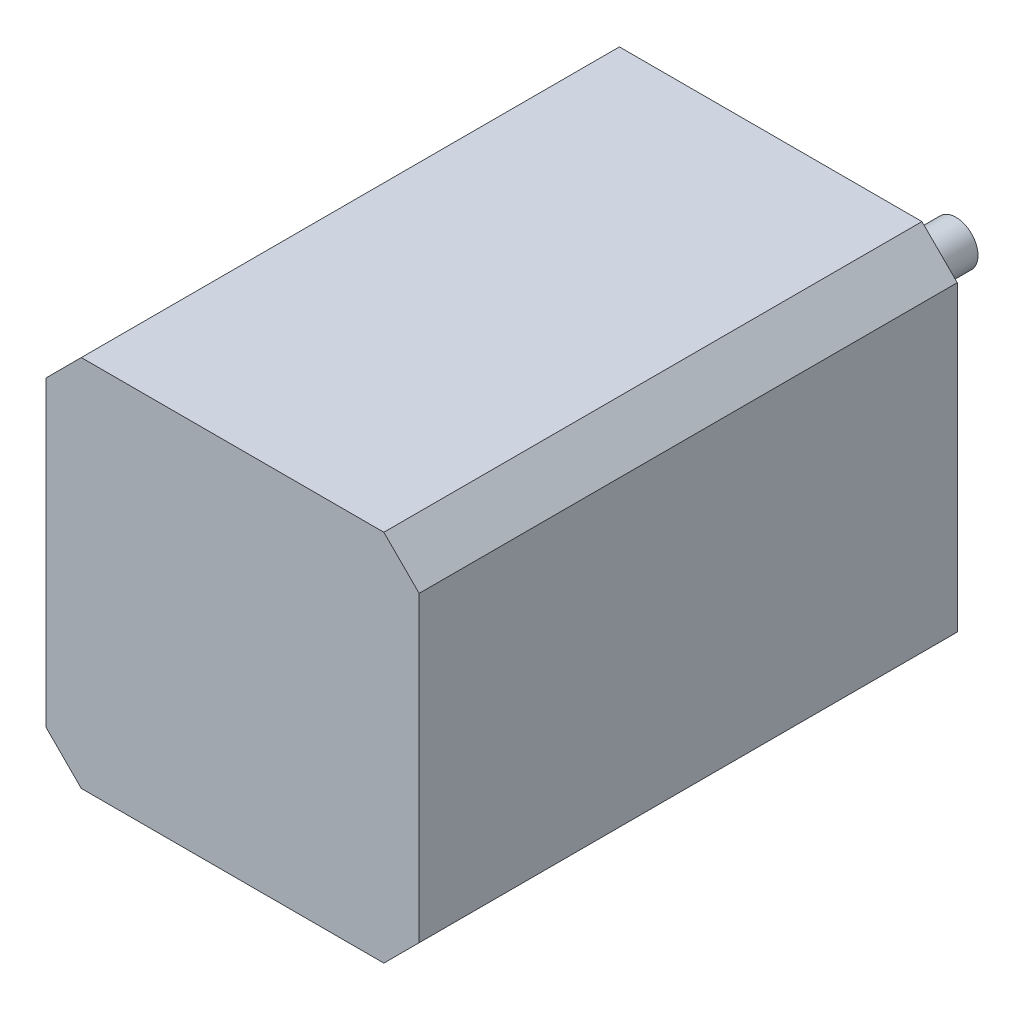
ISO-10303-21;
HEADER;
FILE_DESCRIPTION(('STEP AP214'),'2;1');
FILE_NAME('part.step','',(''),(''),'','','');
FILE_SCHEMA(('AUTOMOTIVE_DESIGN { 1 0 10303 214 1 1 1 1 }'));
ENDSEC;
DATA;
#1=APPLICATION_CONTEXT('core data for automotive mechanical design processes');
#2=APPLICATION_PROTOCOL_DEFINITION('international standard','automotive_design',2000,#1);
#3=PRODUCT_CONTEXT('',#1,'mechanical');
#4=PRODUCT('Part','Part','',(#3));
#5=PRODUCT_RELATED_PRODUCT_CATEGORY('part','',(#4));
#6=PRODUCT_DEFINITION_FORMATION('','',#4);
#7=PRODUCT_DEFINITION_CONTEXT('part definition',#1,'design');
#8=PRODUCT_DEFINITION('design','',#6,#7);
#9=PRODUCT_DEFINITION_SHAPE('','',#8);
#10=(LENGTH_UNIT() NAMED_UNIT(*) SI_UNIT(.MILLI.,.METRE.));
#11=(NAMED_UNIT(*) PLANE_ANGLE_UNIT() SI_UNIT($,.RADIAN.));
#12=(NAMED_UNIT(*) SI_UNIT($,.STERADIAN.) SOLID_ANGLE_UNIT());
#13=UNCERTAINTY_MEASURE_WITH_UNIT(LENGTH_MEASURE(1.E-05),#10,'distance_accuracy_value','');
#14=(GEOMETRIC_REPRESENTATION_CONTEXT(3) GLOBAL_UNCERTAINTY_ASSIGNED_CONTEXT((#13)) GLOBAL_UNIT_ASSIGNED_CONTEXT((#10,
#11,#12)) REPRESENTATION_CONTEXT('',''));
#15=CARTESIAN_POINT('',(0.,0.,0.));
#16=DIRECTION('',(0.,0.,1.));
#17=DIRECTION('',(1.,0.,0.));
#18=AXIS2_PLACEMENT_3D('',#15,#16,#17);
#19=CARTESIAN_POINT('',(0.,0.,-21.));
#20=DIRECTION('',(0.,0.,1.));
#21=DIRECTION('',(1.,0.,0.));
#22=AXIS2_PLACEMENT_3D('',#19,#20,#21);
#23=CYLINDRICAL_SURFACE('',#22,2.5);
#24=CARTESIAN_POINT('',(0.,0.,-21.));
#25=DIRECTION('',(0.,0.,1.));
#26=DIRECTION('',(1.,0.,0.));
#27=AXIS2_PLACEMENT_3D('',#24,#25,#26);
#28=CIRCLE('',#27,2.5);
#29=CARTESIAN_POINT('',(2.5,0.,-21.));
#30=VERTEX_POINT('',#29);
#31=EDGE_CURVE('E11',#30,#30,#28,.T.);
#32=ORIENTED_EDGE('',*,*,#31,.T.);
#33=EDGE_LOOP('',(#32));
#34=FACE_BOUND('',#33,.T.);
#35=CARTESIAN_POINT('',(0.,0.,-2.));
#36=DIRECTION('',(0.,0.,1.));
#37=DIRECTION('',(1.,0.,0.));
#38=AXIS2_PLACEMENT_3D('',#35,#36,#37);
#39=CIRCLE('',#38,2.5);
#40=CARTESIAN_POINT('',(2.5,0.,-2.));
#41=VERTEX_POINT('',#40);
#42=EDGE_CURVE('E53',#41,#41,#39,.T.);
#43=ORIENTED_EDGE('',*,*,#42,.F.);
#44=EDGE_LOOP('',(#43));
#45=FACE_BOUND('',#44,.T.);
#46=ADVANCED_FACE('F50',(#34,#45),#23,.T.);
#47=CARTESIAN_POINT('',(0.,0.,-21.));
#48=DIRECTION('',(0.,0.,1.));
#49=DIRECTION('',(1.,0.,0.));
#50=AXIS2_PLACEMENT_3D('',#47,#48,#49);
#51=PLANE('',#50);
#52=ORIENTED_EDGE('',*,*,#31,.F.);
#53=EDGE_LOOP('',(#52));
#54=FACE_BOUND('',#53,.T.);
#55=ADVANCED_FACE('F65',(#54),#51,.F.);
#56=CARTESIAN_POINT('',(0.,0.,-2.));
#57=DIRECTION('',(0.,0.,1.));
#58=DIRECTION('',(1.,0.,0.));
#59=AXIS2_PLACEMENT_3D('',#56,#57,#58);
#60=PLANE('',#59);
#61=ORIENTED_EDGE('',*,*,#42,.T.);
#62=EDGE_LOOP('',(#61));
#63=FACE_BOUND('',#62,.T.);
#64=ADVANCED_FACE('F62',(#63),#60,.T.);
#65=CLOSED_SHELL('',(#46,#55,#64));
#66=MANIFOLD_SOLID_BREP('B2',#65);
#67=CARTESIAN_POINT('',(21.15,0.,61.));
#68=DIRECTION('',(1.,0.,0.));
#69=DIRECTION('',(0.,1.,0.));
#70=AXIS2_PLACEMENT_3D('',#67,#68,#69);
#71=PLANE('',#70);
#72=DIRECTION('',(0.,-1.,0.));
#73=VECTOR('',#72,1.);
#74=CARTESIAN_POINT('',(21.15,0.,61.));
#75=LINE('',#74,#73);
#76=CARTESIAN_POINT('',(21.15,17.15,61.));
#77=VERTEX_POINT('',#76);
#78=CARTESIAN_POINT('',(21.15,-17.15,61.));
#79=VERTEX_POINT('',#78);
#80=EDGE_CURVE('E216',#77,#79,#75,.T.);
#81=ORIENTED_EDGE('',*,*,#80,.T.);
#82=DIRECTION('',(0.,0.,-1.));
#83=VECTOR('',#82,1.);
#84=CARTESIAN_POINT('',(21.15,-17.15,0.));
#85=LINE('',#84,#83);
#86=CARTESIAN_POINT('',(21.15,-17.15,0.));
#87=VERTEX_POINT('',#86);
#88=EDGE_CURVE('E176',#79,#87,#85,.T.);
#89=ORIENTED_EDGE('',*,*,#88,.T.);
#90=DIRECTION('',(0.,-1.,0.));
#91=VECTOR('',#90,1.);
#92=CARTESIAN_POINT('',(21.15,0.,0.));
#93=LINE('',#92,#91);
#94=CARTESIAN_POINT('',(21.15,17.15,0.));
#95=VERTEX_POINT('',#94);
#96=EDGE_CURVE('E160',#95,#87,#93,.T.);
#97=ORIENTED_EDGE('',*,*,#96,.F.);
#98=DIRECTION('',(0.,0.,1.));
#99=VECTOR('',#98,1.);
#100=CARTESIAN_POINT('',(21.15,17.15,61.));
#101=LINE('',#100,#99);
#102=EDGE_CURVE('E173',#95,#77,#101,.T.);
#103=ORIENTED_EDGE('',*,*,#102,.T.);
#104=EDGE_LOOP('',(#81,#89,#97,#103));
#105=FACE_BOUND('',#104,.T.);
#106=ADVANCED_FACE('F90',(#105),#71,.T.);
#107=CARTESIAN_POINT('',(0.,21.15,61.));
#108=DIRECTION('',(0.,1.,0.));
#109=DIRECTION('',(0.,0.,1.));
#110=AXIS2_PLACEMENT_3D('',#107,#108,#109);
#111=PLANE('',#110);
#112=DIRECTION('',(1.,0.,0.));
#113=VECTOR('',#112,1.);
#114=CARTESIAN_POINT('',(0.,21.15,61.));
#115=LINE('',#114,#113);
#116=CARTESIAN_POINT('',(-17.15,21.15,61.));
#117=VERTEX_POINT('',#116);
#118=CARTESIAN_POINT('',(17.15,21.15,61.));
#119=VERTEX_POINT('',#118);
#120=EDGE_CURVE('E214',#117,#119,#115,.T.);
#121=ORIENTED_EDGE('',*,*,#120,.T.);
#122=DIRECTION('',(0.,0.,-1.));
#123=VECTOR('',#122,1.);
#124=CARTESIAN_POINT('',(17.15,21.15,61.));
#125=LINE('',#124,#123);
#126=CARTESIAN_POINT('',(17.15,21.15,0.));
#127=VERTEX_POINT('',#126);
#128=EDGE_CURVE('E209',#119,#127,#125,.T.);
#129=ORIENTED_EDGE('',*,*,#128,.T.);
#130=DIRECTION('',(1.,0.,0.));
#131=VECTOR('',#130,1.);
#132=CARTESIAN_POINT('',(0.,21.15,0.));
#133=LINE('',#132,#131);
#134=CARTESIAN_POINT('',(-17.15,21.15,0.));
#135=VERTEX_POINT('',#134);
#136=EDGE_CURVE('E162',#135,#127,#133,.T.);
#137=ORIENTED_EDGE('',*,*,#136,.F.);
#138=DIRECTION('',(0.,0.,1.));
#139=VECTOR('',#138,1.);
#140=CARTESIAN_POINT('',(-17.15,21.15,61.));
#141=LINE('',#140,#139);
#142=EDGE_CURVE('E207',#135,#117,#141,.T.);
#143=ORIENTED_EDGE('',*,*,#142,.T.);
#144=EDGE_LOOP('',(#121,#129,#137,#143));
#145=FACE_BOUND('',#144,.T.);
#146=ADVANCED_FACE('F212',(#145),#111,.T.);
#147=CARTESIAN_POINT('',(-21.15,0.,61.));
#148=DIRECTION('',(1.,0.,0.));
#149=DIRECTION('',(0.,1.,0.));
#150=AXIS2_PLACEMENT_3D('',#147,#148,#149);
#151=PLANE('',#150);
#152=DIRECTION('',(0.,-1.,0.));
#153=VECTOR('',#152,1.);
#154=CARTESIAN_POINT('',(-21.15,0.,61.));
#155=LINE('',#154,#153);
#156=CARTESIAN_POINT('',(-21.15,17.15,61.));
#157=VERTEX_POINT('',#156);
#158=CARTESIAN_POINT('',(-21.15,-17.15,61.));
#159=VERTEX_POINT('',#158);
#160=EDGE_CURVE('E215',#157,#159,#155,.T.);
#161=ORIENTED_EDGE('',*,*,#160,.F.);
#162=DIRECTION('',(0.,0.,-1.));
#163=VECTOR('',#162,1.);
#164=CARTESIAN_POINT('',(-21.15,17.15,0.));
#165=LINE('',#164,#163);
#166=CARTESIAN_POINT('',(-21.15,17.15,0.));
#167=VERTEX_POINT('',#166);
#168=EDGE_CURVE('E48',#157,#167,#165,.T.);
#169=ORIENTED_EDGE('',*,*,#168,.T.);
#170=DIRECTION('',(0.,-1.,0.));
#171=VECTOR('',#170,1.);
#172=CARTESIAN_POINT('',(-21.15,0.,0.));
#173=LINE('',#172,#171);
#174=CARTESIAN_POINT('',(-21.15,-17.15,0.));
#175=VERTEX_POINT('',#174);
#176=EDGE_CURVE('E224',#167,#175,#173,.T.);
#177=ORIENTED_EDGE('',*,*,#176,.T.);
#178=DIRECTION('',(0.,0.,1.));
#179=VECTOR('',#178,1.);
#180=CARTESIAN_POINT('',(-21.15,-17.15,61.));
#181=LINE('',#180,#179);
#182=EDGE_CURVE('E99',#175,#159,#181,.T.);
#183=ORIENTED_EDGE('',*,*,#182,.T.);
#184=EDGE_LOOP('',(#161,#169,#177,#183));
#185=FACE_BOUND('',#184,.T.);
#186=ADVANCED_FACE('F242',(#185),#151,.F.);
#187=CARTESIAN_POINT('',(0.,-21.15,61.));
#188=DIRECTION('',(0.,1.,0.));
#189=DIRECTION('',(0.,0.,1.));
#190=AXIS2_PLACEMENT_3D('',#187,#188,#189);
#191=PLANE('',#190);
#192=DIRECTION('',(1.,0.,0.));
#193=VECTOR('',#192,1.);
#194=CARTESIAN_POINT('',(0.,-21.15,0.));
#195=LINE('',#194,#193);
#196=CARTESIAN_POINT('',(-17.15,-21.15,0.));
#197=VERTEX_POINT('',#196);
#198=CARTESIAN_POINT('',(17.15,-21.15,0.));
#199=VERTEX_POINT('',#198);
#200=EDGE_CURVE('E190',#197,#199,#195,.T.);
#201=ORIENTED_EDGE('',*,*,#200,.T.);
#202=DIRECTION('',(0.,0.,1.));
#203=VECTOR('',#202,1.);
#204=CARTESIAN_POINT('',(17.15,-21.15,61.));
#205=LINE('',#204,#203);
#206=CARTESIAN_POINT('',(17.15,-21.15,61.));
#207=VERTEX_POINT('',#206);
#208=EDGE_CURVE('E199',#199,#207,#205,.T.);
#209=ORIENTED_EDGE('',*,*,#208,.T.);
#210=DIRECTION('',(1.,0.,0.));
#211=VECTOR('',#210,1.);
#212=CARTESIAN_POINT('',(0.,-21.15,61.));
#213=LINE('',#212,#211);
#214=CARTESIAN_POINT('',(-17.15,-21.15,61.));
#215=VERTEX_POINT('',#214);
#216=EDGE_CURVE('E187',#215,#207,#213,.T.);
#217=ORIENTED_EDGE('',*,*,#216,.F.);
#218=DIRECTION('',(0.,0.,-1.));
#219=VECTOR('',#218,1.);
#220=CARTESIAN_POINT('',(-17.15,-21.15,61.));
#221=LINE('',#220,#219);
#222=EDGE_CURVE('E196',#215,#197,#221,.T.);
#223=ORIENTED_EDGE('',*,*,#222,.T.);
#224=EDGE_LOOP('',(#201,#209,#217,#223));
#225=FACE_BOUND('',#224,.T.);
#226=ADVANCED_FACE('F230',(#225),#191,.F.);
#227=CARTESIAN_POINT('',(0.,0.,61.));
#228=DIRECTION('',(0.,0.,1.));
#229=DIRECTION('',(1.,0.,0.));
#230=AXIS2_PLACEMENT_3D('',#227,#228,#229);
#231=PLANE('',#230);
#232=ORIENTED_EDGE('',*,*,#216,.T.);
#233=DIRECTION('',(0.70710678118655,0.707106781186545,0.));
#234=VECTOR('',#233,1.);
#235=CARTESIAN_POINT('',(19.1499999999999,-19.15,61.));
#236=LINE('',#235,#234);
#237=EDGE_CURVE('E205',#207,#79,#236,.T.);
#238=ORIENTED_EDGE('',*,*,#237,.T.);
#239=ORIENTED_EDGE('',*,*,#80,.F.);
#240=DIRECTION('',(0.707106781186545,-0.70710678118655,0.));
#241=VECTOR('',#240,1.);
#242=CARTESIAN_POINT('',(19.1500000000001,19.1499999999999,61.));
#243=LINE('',#242,#241);
#244=EDGE_CURVE('E181',#77,#119,#243,.F.);
#245=ORIENTED_EDGE('',*,*,#244,.T.);
#246=ORIENTED_EDGE('',*,*,#120,.F.);
#247=DIRECTION('',(-0.707106781186549,-0.707106781186546,0.));
#248=VECTOR('',#247,1.);
#249=CARTESIAN_POINT('',(-19.15,19.15,61.));
#250=LINE('',#249,#248);
#251=EDGE_CURVE('E112',#117,#157,#250,.T.);
#252=ORIENTED_EDGE('',*,*,#251,.T.);
#253=ORIENTED_EDGE('',*,*,#160,.T.);
#254=DIRECTION('',(-0.707106781186546,0.707106781186549,0.));
#255=VECTOR('',#254,1.);
#256=CARTESIAN_POINT('',(-19.15,-19.1499999999999,61.));
#257=LINE('',#256,#255);
#258=EDGE_CURVE('E201',#159,#215,#257,.F.);
#259=ORIENTED_EDGE('',*,*,#258,.T.);
#260=EDGE_LOOP('',(#232,#238,#239,#245,#246,#252,#253,#259));
#261=FACE_BOUND('',#260,.T.);
#262=ADVANCED_FACE('F236',(#261),#231,.T.);
#263=CARTESIAN_POINT('',(0.,0.,0.));
#264=DIRECTION('',(0.,0.,1.));
#265=DIRECTION('',(1.,0.,0.));
#266=AXIS2_PLACEMENT_3D('',#263,#264,#265);
#267=PLANE('',#266);
#268=CARTESIAN_POINT('',(12.7279220613579,-12.7279220613579,0.));
#269=DIRECTION('',(0.,0.,1.));
#270=DIRECTION('',(1.,0.,0.));
#271=AXIS2_PLACEMENT_3D('',#268,#269,#270);
#272=CIRCLE('',#271,2.);
#273=CARTESIAN_POINT('',(14.7279220613579,-12.7279220613579,0.));
#274=VERTEX_POINT('',#273);
#275=EDGE_CURVE('E468',#274,#274,#272,.T.);
#276=ORIENTED_EDGE('',*,*,#275,.T.);
#277=EDGE_LOOP('',(#276));
#278=FACE_BOUND('',#277,.T.);
#279=CARTESIAN_POINT('',(-12.7279220613579,-12.7279220613579,0.));
#280=DIRECTION('',(0.,0.,1.));
#281=DIRECTION('',(1.,0.,0.));
#282=AXIS2_PLACEMENT_3D('',#279,#280,#281);
#283=CIRCLE('',#282,2.);
#284=CARTESIAN_POINT('',(-10.7279220613579,-12.7279220613579,0.));
#285=VERTEX_POINT('',#284);
#286=EDGE_CURVE('E474',#285,#285,#283,.T.);
#287=ORIENTED_EDGE('',*,*,#286,.T.);
#288=EDGE_LOOP('',(#287));
#289=FACE_BOUND('',#288,.T.);
#290=CARTESIAN_POINT('',(-12.7279220613579,12.7279220613579,0.));
#291=DIRECTION('',(0.,0.,1.));
#292=DIRECTION('',(1.,0.,0.));
#293=AXIS2_PLACEMENT_3D('',#290,#291,#292);
#294=CIRCLE('',#293,2.);
#295=CARTESIAN_POINT('',(-10.7279220613579,12.7279220613579,0.));
#296=VERTEX_POINT('',#295);
#297=EDGE_CURVE('E480',#296,#296,#294,.T.);
#298=ORIENTED_EDGE('',*,*,#297,.T.);
#299=EDGE_LOOP('',(#298));
#300=FACE_BOUND('',#299,.T.);
#301=CARTESIAN_POINT('',(12.7279220613579,12.7279220613579,0.));
#302=DIRECTION('',(0.,0.,1.));
#303=DIRECTION('',(1.,0.,0.));
#304=AXIS2_PLACEMENT_3D('',#301,#302,#303);
#305=CIRCLE('',#304,2.);
#306=CARTESIAN_POINT('',(14.7279220613579,12.7279220613579,0.));
#307=VERTEX_POINT('',#306);
#308=EDGE_CURVE('E462',#307,#307,#305,.T.);
#309=ORIENTED_EDGE('',*,*,#308,.T.);
#310=EDGE_LOOP('',(#309));
#311=FACE_BOUND('',#310,.T.);
#312=CARTESIAN_POINT('',(0.,0.,0.));
#313=DIRECTION('',(0.,0.,1.));
#314=DIRECTION('',(1.,0.,0.));
#315=AXIS2_PLACEMENT_3D('',#312,#313,#314);
#316=CIRCLE('',#315,11.);
#317=CARTESIAN_POINT('',(11.,0.,0.));
#318=VERTEX_POINT('',#317);
#319=EDGE_CURVE('E455',#318,#318,#316,.T.);
#320=ORIENTED_EDGE('',*,*,#319,.T.);
#321=EDGE_LOOP('',(#320));
#322=FACE_BOUND('',#321,.T.);
#323=ORIENTED_EDGE('',*,*,#96,.T.);
#324=DIRECTION('',(-0.70710678118655,-0.707106781186545,0.));
#325=VECTOR('',#324,1.);
#326=CARTESIAN_POINT('',(21.15,-17.15,0.));
#327=LINE('',#326,#325);
#328=EDGE_CURVE('E167',#87,#199,#327,.T.);
#329=ORIENTED_EDGE('',*,*,#328,.T.);
#330=ORIENTED_EDGE('',*,*,#200,.F.);
#331=DIRECTION('',(0.707106781186546,-0.707106781186549,0.));
#332=VECTOR('',#331,1.);
#333=CARTESIAN_POINT('',(-17.15,-21.15,0.));
#334=LINE('',#333,#332);
#335=EDGE_CURVE('E184',#197,#175,#334,.F.);
#336=ORIENTED_EDGE('',*,*,#335,.T.);
#337=ORIENTED_EDGE('',*,*,#176,.F.);
#338=DIRECTION('',(0.707106781186549,0.707106781186546,0.));
#339=VECTOR('',#338,1.);
#340=CARTESIAN_POINT('',(-21.15,17.15,0.));
#341=LINE('',#340,#339);
#342=EDGE_CURVE('E168',#167,#135,#341,.T.);
#343=ORIENTED_EDGE('',*,*,#342,.T.);
#344=ORIENTED_EDGE('',*,*,#136,.T.);
#345=DIRECTION('',(-0.707106781186545,0.70710678118655,0.));
#346=VECTOR('',#345,1.);
#347=CARTESIAN_POINT('',(17.15,21.15,0.));
#348=LINE('',#347,#346);
#349=EDGE_CURVE('E157',#127,#95,#348,.F.);
#350=ORIENTED_EDGE('',*,*,#349,.T.);
#351=EDGE_LOOP('',(#323,#329,#330,#336,#337,#343,#344,#350));
#352=FACE_BOUND('',#351,.T.);
#353=ADVANCED_FACE('F159',(#278,#289,#300,#311,#322,#352),#267,.F.);
#354=CARTESIAN_POINT('',(0.,0.,-2.));
#355=DIRECTION('',(0.,0.,1.));
#356=DIRECTION('',(1.,0.,0.));
#357=AXIS2_PLACEMENT_3D('',#354,#355,#356);
#358=CYLINDRICAL_SURFACE('',#357,2.5);
#359=CARTESIAN_POINT('',(0.,0.,-2.));
#360=DIRECTION('',(0.,0.,1.));
#361=DIRECTION('',(1.,0.,0.));
#362=AXIS2_PLACEMENT_3D('',#359,#360,#361);
#363=CIRCLE('',#362,2.5);
#364=CARTESIAN_POINT('',(2.5,0.,-2.));
#365=VERTEX_POINT('',#364);
#366=EDGE_CURVE('E453',#365,#365,#363,.T.);
#367=ORIENTED_EDGE('',*,*,#366,.F.);
#368=EDGE_LOOP('',(#367));
#369=FACE_BOUND('',#368,.T.);
#370=CARTESIAN_POINT('',(0.,0.,0.));
#371=DIRECTION('',(0.,0.,1.));
#372=DIRECTION('',(1.,0.,0.));
#373=AXIS2_PLACEMENT_3D('',#370,#371,#372);
#374=CIRCLE('',#373,2.5);
#375=CARTESIAN_POINT('',(2.5,0.,0.));
#376=VERTEX_POINT('',#375);
#377=EDGE_CURVE('E182',#376,#376,#374,.T.);
#378=ORIENTED_EDGE('',*,*,#377,.T.);
#379=EDGE_LOOP('',(#378));
#380=FACE_BOUND('',#379,.T.);
#381=ADVANCED_FACE('F302',(#369,#380),#358,.F.);
#382=CARTESIAN_POINT('',(0.,0.,-2.));
#383=DIRECTION('',(0.,0.,1.));
#384=DIRECTION('',(1.,0.,0.));
#385=AXIS2_PLACEMENT_3D('',#382,#383,#384);
#386=CYLINDRICAL_SURFACE('',#385,11.);
#387=CARTESIAN_POINT('',(0.,0.,-2.));
#388=DIRECTION('',(0.,0.,1.));
#389=DIRECTION('',(1.,0.,0.));
#390=AXIS2_PLACEMENT_3D('',#387,#388,#389);
#391=CIRCLE('',#390,11.);
#392=CARTESIAN_POINT('',(11.,0.,-2.));
#393=VERTEX_POINT('',#392);
#394=EDGE_CURVE('E177',#393,#393,#391,.T.);
#395=ORIENTED_EDGE('',*,*,#394,.T.);
#396=EDGE_LOOP('',(#395));
#397=FACE_BOUND('',#396,.T.);
#398=ORIENTED_EDGE('',*,*,#319,.F.);
#399=EDGE_LOOP('',(#398));
#400=FACE_BOUND('',#399,.T.);
#401=ADVANCED_FACE('F429',(#397,#400),#386,.T.);
#402=CARTESIAN_POINT('',(0.,0.,-2.));
#403=DIRECTION('',(0.,0.,1.));
#404=DIRECTION('',(1.,0.,0.));
#405=AXIS2_PLACEMENT_3D('',#402,#403,#404);
#406=PLANE('',#405);
#407=ORIENTED_EDGE('',*,*,#366,.T.);
#408=EDGE_LOOP('',(#407));
#409=FACE_BOUND('',#408,.T.);
#410=ORIENTED_EDGE('',*,*,#394,.F.);
#411=EDGE_LOOP('',(#410));
#412=FACE_BOUND('',#411,.T.);
#413=ADVANCED_FACE('F420',(#409,#412),#406,.F.);
#414=ORIENTED_EDGE('',*,*,#377,.F.);
#415=EDGE_LOOP('',(#414));
#416=FACE_BOUND('',#415,.T.);
#417=ADVANCED_FACE('F305',(#416),#267,.F.);
#418=CARTESIAN_POINT('',(12.7279220613579,12.7279220613579,2.));
#419=DIRECTION('',(0.,0.,-1.));
#420=DIRECTION('',(-1.,0.,0.));
#421=AXIS2_PLACEMENT_3D('',#418,#419,#420);
#422=CYLINDRICAL_SURFACE('',#421,2.);
#423=CARTESIAN_POINT('',(12.7279220613579,12.7279220613579,2.));
#424=DIRECTION('',(0.,0.,1.));
#425=DIRECTION('',(1.,0.,0.));
#426=AXIS2_PLACEMENT_3D('',#423,#424,#425);
#427=CIRCLE('',#426,2.);
#428=CARTESIAN_POINT('',(14.7279220613579,12.7279220613579,2.));
#429=VERTEX_POINT('',#428);
#430=EDGE_CURVE('E460',#429,#429,#427,.T.);
#431=ORIENTED_EDGE('',*,*,#430,.T.);
#432=EDGE_LOOP('',(#431));
#433=FACE_BOUND('',#432,.T.);
#434=ORIENTED_EDGE('',*,*,#308,.F.);
#435=EDGE_LOOP('',(#434));
#436=FACE_BOUND('',#435,.T.);
#437=ADVANCED_FACE('F401',(#433,#436),#422,.F.);
#438=CARTESIAN_POINT('',(0.,0.,2.));
#439=DIRECTION('',(0.,0.,1.));
#440=DIRECTION('',(1.,0.,0.));
#441=AXIS2_PLACEMENT_3D('',#438,#439,#440);
#442=PLANE('',#441);
#443=ORIENTED_EDGE('',*,*,#430,.F.);
#444=EDGE_LOOP('',(#443));
#445=FACE_BOUND('',#444,.T.);
#446=ADVANCED_FACE('F391',(#445),#442,.F.);
#447=CARTESIAN_POINT('',(-12.7279220613579,12.7279220613579,2.));
#448=DIRECTION('',(0.,0.,-1.));
#449=DIRECTION('',(-1.,0.,0.));
#450=AXIS2_PLACEMENT_3D('',#447,#448,#449);
#451=CYLINDRICAL_SURFACE('',#450,2.);
#452=CARTESIAN_POINT('',(-12.7279220613579,12.7279220613579,2.));
#453=DIRECTION('',(0.,0.,1.));
#454=DIRECTION('',(1.,0.,0.));
#455=AXIS2_PLACEMENT_3D('',#452,#453,#454);
#456=CIRCLE('',#455,2.);
#457=CARTESIAN_POINT('',(-10.7279220613579,12.7279220613579,2.));
#458=VERTEX_POINT('',#457);
#459=EDGE_CURVE('E465',#458,#458,#456,.T.);
#460=ORIENTED_EDGE('',*,*,#459,.T.);
#461=EDGE_LOOP('',(#460));
#462=FACE_BOUND('',#461,.T.);
#463=ORIENTED_EDGE('',*,*,#297,.F.);
#464=EDGE_LOOP('',(#463));
#465=FACE_BOUND('',#464,.T.);
#466=ADVANCED_FACE('F381',(#462,#465),#451,.F.);
#467=CARTESIAN_POINT('',(0.,0.,2.));
#468=DIRECTION('',(0.,0.,1.));
#469=DIRECTION('',(1.,0.,0.));
#470=AXIS2_PLACEMENT_3D('',#467,#468,#469);
#471=PLANE('',#470);
#472=ORIENTED_EDGE('',*,*,#459,.F.);
#473=EDGE_LOOP('',(#472));
#474=FACE_BOUND('',#473,.T.);
#475=ADVANCED_FACE('F371',(#474),#471,.F.);
#476=CARTESIAN_POINT('',(-12.7279220613579,-12.7279220613579,2.));
#477=DIRECTION('',(0.,0.,-1.));
#478=DIRECTION('',(-1.,0.,0.));
#479=AXIS2_PLACEMENT_3D('',#476,#477,#478);
#480=CYLINDRICAL_SURFACE('',#479,2.);
#481=CARTESIAN_POINT('',(-12.7279220613579,-12.7279220613579,2.));
#482=DIRECTION('',(0.,0.,1.));
#483=DIRECTION('',(1.,0.,0.));
#484=AXIS2_PLACEMENT_3D('',#481,#482,#483);
#485=CIRCLE('',#484,2.);
#486=CARTESIAN_POINT('',(-10.7279220613579,-12.7279220613579,2.));
#487=VERTEX_POINT('',#486);
#488=EDGE_CURVE('E477',#487,#487,#485,.T.);
#489=ORIENTED_EDGE('',*,*,#488,.T.);
#490=EDGE_LOOP('',(#489));
#491=FACE_BOUND('',#490,.T.);
#492=ORIENTED_EDGE('',*,*,#286,.F.);
#493=EDGE_LOOP('',(#492));
#494=FACE_BOUND('',#493,.T.);
#495=ADVANCED_FACE('F361',(#491,#494),#480,.F.);
#496=CARTESIAN_POINT('',(0.,0.,2.));
#497=DIRECTION('',(0.,0.,1.));
#498=DIRECTION('',(1.,0.,0.));
#499=AXIS2_PLACEMENT_3D('',#496,#497,#498);
#500=PLANE('',#499);
#501=ORIENTED_EDGE('',*,*,#488,.F.);
#502=EDGE_LOOP('',(#501));
#503=FACE_BOUND('',#502,.T.);
#504=ADVANCED_FACE('F351',(#503),#500,.F.);
#505=CARTESIAN_POINT('',(12.7279220613579,-12.7279220613579,2.));
#506=DIRECTION('',(0.,0.,-1.));
#507=DIRECTION('',(-1.,0.,0.));
#508=AXIS2_PLACEMENT_3D('',#505,#506,#507);
#509=CYLINDRICAL_SURFACE('',#508,2.);
#510=CARTESIAN_POINT('',(12.7279220613579,-12.7279220613579,2.));
#511=DIRECTION('',(0.,0.,1.));
#512=DIRECTION('',(1.,0.,0.));
#513=AXIS2_PLACEMENT_3D('',#510,#511,#512);
#514=CIRCLE('',#513,2.);
#515=CARTESIAN_POINT('',(14.7279220613579,-12.7279220613579,2.));
#516=VERTEX_POINT('',#515);
#517=EDGE_CURVE('E471',#516,#516,#514,.T.);
#518=ORIENTED_EDGE('',*,*,#517,.T.);
#519=EDGE_LOOP('',(#518));
#520=FACE_BOUND('',#519,.T.);
#521=ORIENTED_EDGE('',*,*,#275,.F.);
#522=EDGE_LOOP('',(#521));
#523=FACE_BOUND('',#522,.T.);
#524=ADVANCED_FACE('F341',(#520,#523),#509,.F.);
#525=CARTESIAN_POINT('',(0.,0.,2.));
#526=DIRECTION('',(0.,0.,1.));
#527=DIRECTION('',(1.,0.,0.));
#528=AXIS2_PLACEMENT_3D('',#525,#526,#527);
#529=PLANE('',#528);
#530=ORIENTED_EDGE('',*,*,#517,.F.);
#531=EDGE_LOOP('',(#530));
#532=FACE_BOUND('',#531,.T.);
#533=ADVANCED_FACE('F262',(#532),#529,.F.);
#534=CARTESIAN_POINT('',(21.15,-17.15,61.));
#535=DIRECTION('',(0.707106781186545,-0.70710678118655,0.));
#536=DIRECTION('',(0.,0.,1.));
#537=AXIS2_PLACEMENT_3D('',#534,#535,#536);
#538=PLANE('',#537);
#539=ORIENTED_EDGE('',*,*,#237,.F.);
#540=ORIENTED_EDGE('',*,*,#208,.F.);
#541=ORIENTED_EDGE('',*,*,#328,.F.);
#542=ORIENTED_EDGE('',*,*,#88,.F.);
#543=EDGE_LOOP('',(#539,#540,#541,#542));
#544=FACE_BOUND('',#543,.T.);
#545=ADVANCED_FACE('F235',(#544),#538,.T.);
#546=CARTESIAN_POINT('',(17.15,21.15,61.));
#547=DIRECTION('',(-0.70710678118655,-0.707106781186545,0.));
#548=DIRECTION('',(0.,0.,-1.));
#549=AXIS2_PLACEMENT_3D('',#546,#547,#548);
#550=PLANE('',#549);
#551=ORIENTED_EDGE('',*,*,#244,.F.);
#552=ORIENTED_EDGE('',*,*,#102,.F.);
#553=ORIENTED_EDGE('',*,*,#349,.F.);
#554=ORIENTED_EDGE('',*,*,#128,.F.);
#555=EDGE_LOOP('',(#551,#552,#553,#554));
#556=FACE_BOUND('',#555,.T.);
#557=ADVANCED_FACE('F180',(#556),#550,.F.);
#558=CARTESIAN_POINT('',(-21.15,17.15,61.));
#559=DIRECTION('',(-0.707106781186546,0.707106781186549,0.));
#560=DIRECTION('',(0.,0.,1.));
#561=AXIS2_PLACEMENT_3D('',#558,#559,#560);
#562=PLANE('',#561);
#563=ORIENTED_EDGE('',*,*,#251,.F.);
#564=ORIENTED_EDGE('',*,*,#142,.F.);
#565=ORIENTED_EDGE('',*,*,#342,.F.);
#566=ORIENTED_EDGE('',*,*,#168,.F.);
#567=EDGE_LOOP('',(#563,#564,#565,#566));
#568=FACE_BOUND('',#567,.T.);
#569=ADVANCED_FACE('F241',(#568),#562,.T.);
#570=CARTESIAN_POINT('',(-17.15,-21.15,61.));
#571=DIRECTION('',(0.707106781186549,0.707106781186546,0.));
#572=DIRECTION('',(0.,0.,-1.));
#573=AXIS2_PLACEMENT_3D('',#570,#571,#572);
#574=PLANE('',#573);
#575=ORIENTED_EDGE('',*,*,#258,.F.);
#576=ORIENTED_EDGE('',*,*,#182,.F.);
#577=ORIENTED_EDGE('',*,*,#335,.F.);
#578=ORIENTED_EDGE('',*,*,#222,.F.);
#579=EDGE_LOOP('',(#575,#576,#577,#578));
#580=FACE_BOUND('',#579,.T.);
#581=ADVANCED_FACE('F93',(#580),#574,.F.);
#582=CLOSED_SHELL('',(#106,#146,#186,#226,#262,#353,#381,#401,#413,#417,#437,#446,#466,#475,
#495,#504,#524,#533,#545,#557,#569,#581));
#583=MANIFOLD_SOLID_BREP('B6',#582);
#584=ADVANCED_BREP_SHAPE_REPRESENTATION('',(#18,#66,#583),#14);
#585=SHAPE_DEFINITION_REPRESENTATION(#9,#584);
ENDSEC;
END-ISO-10303-21;
